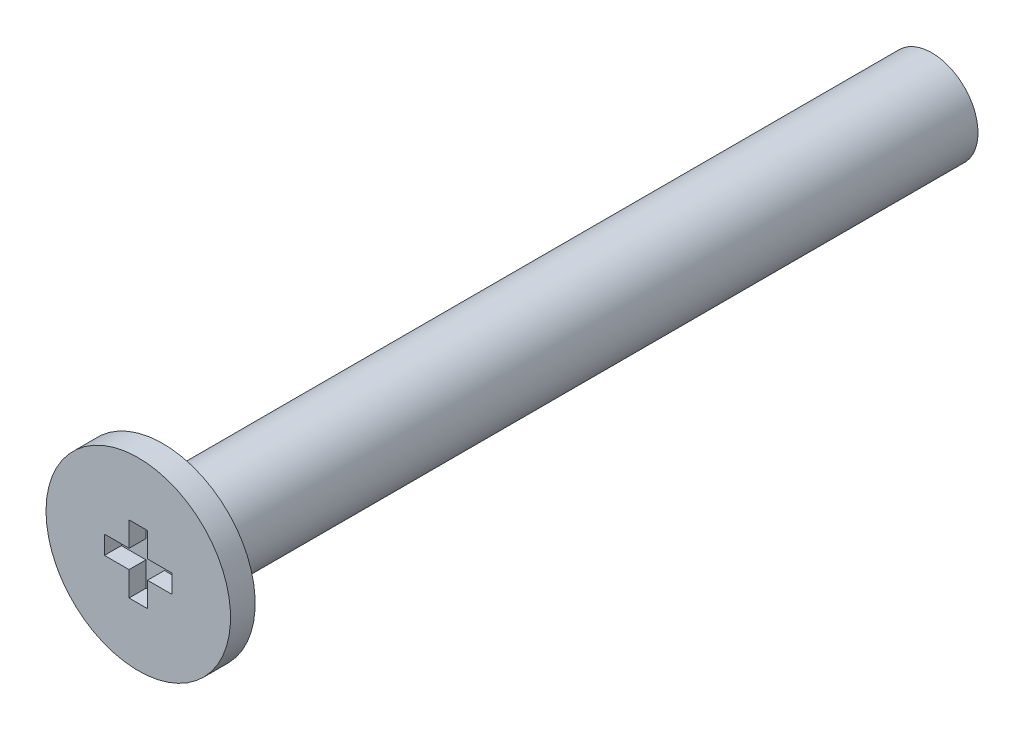
ISO-10303-21;
HEADER;
FILE_DESCRIPTION(('STEP AP214'),'2;1');
FILE_NAME('part.step','',(''),(''),'','','');
FILE_SCHEMA(('AUTOMOTIVE_DESIGN { 1 0 10303 214 1 1 1 1 }'));
ENDSEC;
DATA;
#1=APPLICATION_CONTEXT('core data for automotive mechanical design processes');
#2=APPLICATION_PROTOCOL_DEFINITION('international standard','automotive_design',2000,#1);
#3=PRODUCT_CONTEXT('',#1,'mechanical');
#4=PRODUCT('Part','Part','',(#3));
#5=PRODUCT_RELATED_PRODUCT_CATEGORY('part','',(#4));
#6=PRODUCT_DEFINITION_FORMATION('','',#4);
#7=PRODUCT_DEFINITION_CONTEXT('part definition',#1,'design');
#8=PRODUCT_DEFINITION('design','',#6,#7);
#9=PRODUCT_DEFINITION_SHAPE('','',#8);
#10=(LENGTH_UNIT() NAMED_UNIT(*) SI_UNIT(.MILLI.,.METRE.));
#11=(NAMED_UNIT(*) PLANE_ANGLE_UNIT() SI_UNIT($,.RADIAN.));
#12=(NAMED_UNIT(*) SI_UNIT($,.STERADIAN.) SOLID_ANGLE_UNIT());
#13=UNCERTAINTY_MEASURE_WITH_UNIT(LENGTH_MEASURE(1.E-05),#10,'distance_accuracy_value','');
#14=(GEOMETRIC_REPRESENTATION_CONTEXT(3) GLOBAL_UNCERTAINTY_ASSIGNED_CONTEXT((#13)) GLOBAL_UNIT_ASSIGNED_CONTEXT((#10,
#11,#12)) REPRESENTATION_CONTEXT('',''));
#15=CARTESIAN_POINT('',(0.,0.,0.));
#16=DIRECTION('',(0.,0.,1.));
#17=DIRECTION('',(1.,0.,0.));
#18=AXIS2_PLACEMENT_3D('',#15,#16,#17);
#19=CARTESIAN_POINT('',(0.,0.,-25.));
#20=DIRECTION('',(0.,0.,1.));
#21=DIRECTION('',(1.,0.,0.));
#22=AXIS2_PLACEMENT_3D('',#19,#20,#21);
#23=CYLINDRICAL_SURFACE('',#22,1.5);
#24=CARTESIAN_POINT('',(0.,0.,-25.));
#25=DIRECTION('',(0.,0.,1.));
#26=DIRECTION('',(1.,0.,0.));
#27=AXIS2_PLACEMENT_3D('',#24,#25,#26);
#28=CIRCLE('',#27,1.5);
#29=CARTESIAN_POINT('',(1.5,0.,-25.));
#30=VERTEX_POINT('',#29);
#31=EDGE_CURVE('E212',#30,#30,#28,.T.);
#32=ORIENTED_EDGE('',*,*,#31,.T.);
#33=EDGE_LOOP('',(#32));
#34=FACE_BOUND('',#33,.T.);
#35=CARTESIAN_POINT('',(0.,0.,0.));
#36=DIRECTION('',(0.,0.,1.));
#37=DIRECTION('',(1.,0.,0.));
#38=AXIS2_PLACEMENT_3D('',#35,#36,#37);
#39=CIRCLE('',#38,1.5);
#40=CARTESIAN_POINT('',(1.5,0.,0.));
#41=VERTEX_POINT('',#40);
#42=EDGE_CURVE('E208',#41,#41,#39,.T.);
#43=ORIENTED_EDGE('',*,*,#42,.F.);
#44=EDGE_LOOP('',(#43));
#45=FACE_BOUND('',#44,.T.);
#46=ADVANCED_FACE('F41',(#34,#45),#23,.T.);
#47=CARTESIAN_POINT('',(0.,0.,-25.));
#48=DIRECTION('',(0.,0.,1.));
#49=DIRECTION('',(1.,0.,0.));
#50=AXIS2_PLACEMENT_3D('',#47,#48,#49);
#51=PLANE('',#50);
#52=ORIENTED_EDGE('',*,*,#31,.F.);
#53=EDGE_LOOP('',(#52));
#54=FACE_BOUND('',#53,.T.);
#55=ADVANCED_FACE('F281',(#54),#51,.F.);
#56=CARTESIAN_POINT('',(0.,0.,0.));
#57=DIRECTION('',(0.,0.,1.));
#58=DIRECTION('',(1.,0.,0.));
#59=AXIS2_PLACEMENT_3D('',#56,#57,#58);
#60=PLANE('',#59);
#61=ORIENTED_EDGE('',*,*,#42,.T.);
#62=EDGE_LOOP('',(#61));
#63=FACE_BOUND('',#62,.T.);
#64=CARTESIAN_POINT('',(0.,0.,0.));
#65=DIRECTION('',(0.,0.,-1.));
#66=DIRECTION('',(-1.,0.,0.));
#67=AXIS2_PLACEMENT_3D('',#64,#65,#66);
#68=CIRCLE('',#67,3.);
#69=CARTESIAN_POINT('',(-3.,0.,0.));
#70=VERTEX_POINT('',#69);
#71=EDGE_CURVE('E210',#70,#70,#68,.T.);
#72=ORIENTED_EDGE('',*,*,#71,.T.);
#73=EDGE_LOOP('',(#72));
#74=FACE_BOUND('',#73,.T.);
#75=ADVANCED_FACE('F286',(#63,#74),#60,.F.);
#76=CARTESIAN_POINT('',(0.,0.,-2.));
#77=DIRECTION('',(0.,0.,-1.));
#78=DIRECTION('',(-1.,0.,0.));
#79=AXIS2_PLACEMENT_3D('',#76,#77,#78);
#80=CYLINDRICAL_SURFACE('',#79,3.);
#81=ORIENTED_EDGE('',*,*,#71,.F.);
#82=EDGE_LOOP('',(#81));
#83=FACE_BOUND('',#82,.T.);
#84=CARTESIAN_POINT('',(0.,0.,0.8));
#85=DIRECTION('',(0.,0.,-1.));
#86=DIRECTION('',(-1.,0.,0.));
#87=AXIS2_PLACEMENT_3D('',#84,#85,#86);
#88=CIRCLE('',#87,3.);
#89=CARTESIAN_POINT('',(-3.,0.,0.8));
#90=VERTEX_POINT('',#89);
#91=EDGE_CURVE('E179',#90,#90,#88,.T.);
#92=ORIENTED_EDGE('',*,*,#91,.T.);
#93=EDGE_LOOP('',(#92));
#94=FACE_BOUND('',#93,.T.);
#95=ADVANCED_FACE('F300',(#83,#94),#80,.T.);
#96=CARTESIAN_POINT('',(3.,0.,0.8));
#97=DIRECTION('',(0.,0.,-1.));
#98=DIRECTION('',(-1.,0.,0.));
#99=AXIS2_PLACEMENT_3D('',#96,#97,#98);
#100=PLANE('',#99);
#101=DIRECTION('',(-1.,0.,0.));
#102=VECTOR('',#101,1.);
#103=CARTESIAN_POINT('',(3.,-1.1,0.8));
#104=LINE('',#103,#102);
#105=CARTESIAN_POINT('',(0.3,-1.1,0.8));
#106=VERTEX_POINT('',#105);
#107=CARTESIAN_POINT('',(-0.3,-1.1,0.8));
#108=VERTEX_POINT('',#107);
#109=EDGE_CURVE('E211',#106,#108,#104,.T.);
#110=ORIENTED_EDGE('',*,*,#109,.T.);
#111=DIRECTION('',(0.,1.,0.));
#112=VECTOR('',#111,1.);
#113=CARTESIAN_POINT('',(-0.3,0.,0.8));
#114=LINE('',#113,#112);
#115=CARTESIAN_POINT('',(-0.3,-0.3,0.8));
#116=VERTEX_POINT('',#115);
#117=EDGE_CURVE('E11',#108,#116,#114,.T.);
#118=ORIENTED_EDGE('',*,*,#117,.T.);
#119=DIRECTION('',(-1.,0.,0.));
#120=VECTOR('',#119,1.);
#121=CARTESIAN_POINT('',(3.,-0.3,0.8));
#122=LINE('',#121,#120);
#123=CARTESIAN_POINT('',(-1.1,-0.3,0.8));
#124=VERTEX_POINT('',#123);
#125=EDGE_CURVE('E48',#116,#124,#122,.T.);
#126=ORIENTED_EDGE('',*,*,#125,.T.);
#127=DIRECTION('',(0.,1.,0.));
#128=VECTOR('',#127,1.);
#129=CARTESIAN_POINT('',(-1.1,0.,0.8));
#130=LINE('',#129,#128);
#131=CARTESIAN_POINT('',(-1.1,0.3,0.8));
#132=VERTEX_POINT('',#131);
#133=EDGE_CURVE('E241',#124,#132,#130,.T.);
#134=ORIENTED_EDGE('',*,*,#133,.T.);
#135=DIRECTION('',(1.,0.,0.));
#136=VECTOR('',#135,1.);
#137=CARTESIAN_POINT('',(3.,0.3,0.8));
#138=LINE('',#137,#136);
#139=CARTESIAN_POINT('',(-0.3,0.3,0.8));
#140=VERTEX_POINT('',#139);
#141=EDGE_CURVE('E236',#132,#140,#138,.T.);
#142=ORIENTED_EDGE('',*,*,#141,.T.);
#143=DIRECTION('',(0.,1.,0.));
#144=VECTOR('',#143,1.);
#145=CARTESIAN_POINT('',(-0.3,0.,0.8));
#146=LINE('',#145,#144);
#147=CARTESIAN_POINT('',(-0.3,1.1,0.8));
#148=VERTEX_POINT('',#147);
#149=EDGE_CURVE('E237',#140,#148,#146,.T.);
#150=ORIENTED_EDGE('',*,*,#149,.T.);
#151=DIRECTION('',(1.,0.,0.));
#152=VECTOR('',#151,1.);
#153=CARTESIAN_POINT('',(3.,1.1,0.8));
#154=LINE('',#153,#152);
#155=CARTESIAN_POINT('',(0.3,1.1,0.8));
#156=VERTEX_POINT('',#155);
#157=EDGE_CURVE('E231',#148,#156,#154,.T.);
#158=ORIENTED_EDGE('',*,*,#157,.T.);
#159=DIRECTION('',(0.,-1.,0.));
#160=VECTOR('',#159,1.);
#161=CARTESIAN_POINT('',(0.3,0.,0.8));
#162=LINE('',#161,#160);
#163=CARTESIAN_POINT('',(0.3,0.3,0.8));
#164=VERTEX_POINT('',#163);
#165=EDGE_CURVE('E228',#156,#164,#162,.T.);
#166=ORIENTED_EDGE('',*,*,#165,.T.);
#167=DIRECTION('',(1.,0.,0.));
#168=VECTOR('',#167,1.);
#169=CARTESIAN_POINT('',(3.,0.3,0.8));
#170=LINE('',#169,#168);
#171=CARTESIAN_POINT('',(1.1,0.3,0.8));
#172=VERTEX_POINT('',#171);
#173=EDGE_CURVE('E229',#164,#172,#170,.T.);
#174=ORIENTED_EDGE('',*,*,#173,.T.);
#175=DIRECTION('',(0.,-1.,0.));
#176=VECTOR('',#175,1.);
#177=CARTESIAN_POINT('',(1.1,0.,0.8));
#178=LINE('',#177,#176);
#179=CARTESIAN_POINT('',(1.1,-0.3,0.8));
#180=VERTEX_POINT('',#179);
#181=EDGE_CURVE('E224',#172,#180,#178,.T.);
#182=ORIENTED_EDGE('',*,*,#181,.T.);
#183=DIRECTION('',(-1.,0.,0.));
#184=VECTOR('',#183,1.);
#185=CARTESIAN_POINT('',(3.,-0.3,0.8));
#186=LINE('',#185,#184);
#187=CARTESIAN_POINT('',(0.3,-0.3,0.8));
#188=VERTEX_POINT('',#187);
#189=EDGE_CURVE('E222',#180,#188,#186,.T.);
#190=ORIENTED_EDGE('',*,*,#189,.T.);
#191=DIRECTION('',(0.,-1.,0.));
#192=VECTOR('',#191,1.);
#193=CARTESIAN_POINT('',(0.3,0.,0.8));
#194=LINE('',#193,#192);
#195=EDGE_CURVE('E220',#188,#106,#194,.T.);
#196=ORIENTED_EDGE('',*,*,#195,.T.);
#197=EDGE_LOOP('',(#110,#118,#126,#134,#142,#150,#158,#166,#174,#182,#190,#196));
#198=FACE_BOUND('',#197,.T.);
#199=ORIENTED_EDGE('',*,*,#91,.F.);
#200=EDGE_LOOP('',(#199));
#201=FACE_BOUND('',#200,.T.);
#202=ADVANCED_FACE('F242',(#198,#201),#100,.F.);
#203=CARTESIAN_POINT('',(-0.3,-0.3,0.25));
#204=DIRECTION('',(-1.,0.,0.));
#205=DIRECTION('',(0.,0.,1.));
#206=AXIS2_PLACEMENT_3D('',#203,#204,#205);
#207=PLANE('',#206);
#208=DIRECTION('',(0.,0.,1.));
#209=VECTOR('',#208,1.);
#210=CARTESIAN_POINT('',(-0.3,-1.1,0.25));
#211=LINE('',#210,#209);
#212=CARTESIAN_POINT('',(-0.3,-1.1,0.25));
#213=VERTEX_POINT('',#212);
#214=EDGE_CURVE('E54',#213,#108,#211,.T.);
#215=ORIENTED_EDGE('',*,*,#214,.F.);
#216=DIRECTION('',(0.,-1.,0.));
#217=VECTOR('',#216,1.);
#218=CARTESIAN_POINT('',(-0.3,-0.3,0.25));
#219=LINE('',#218,#217);
#220=CARTESIAN_POINT('',(-0.3,-0.3,0.25));
#221=VERTEX_POINT('',#220);
#222=EDGE_CURVE('E129',#221,#213,#219,.T.);
#223=ORIENTED_EDGE('',*,*,#222,.F.);
#224=DIRECTION('',(0.,0.,1.));
#225=VECTOR('',#224,1.);
#226=CARTESIAN_POINT('',(-0.3,-0.3,0.25));
#227=LINE('',#226,#225);
#228=EDGE_CURVE('E171',#221,#116,#227,.T.);
#229=ORIENTED_EDGE('',*,*,#228,.T.);
#230=ORIENTED_EDGE('',*,*,#117,.F.);
#231=EDGE_LOOP('',(#215,#223,#229,#230));
#232=FACE_BOUND('',#231,.T.);
#233=ADVANCED_FACE('F127',(#232),#207,.F.);
#234=CARTESIAN_POINT('',(-1.1,-0.3,0.25));
#235=DIRECTION('',(0.,-1.,0.));
#236=DIRECTION('',(0.,0.,-1.));
#237=AXIS2_PLACEMENT_3D('',#234,#235,#236);
#238=PLANE('',#237);
#239=ORIENTED_EDGE('',*,*,#228,.F.);
#240=DIRECTION('',(1.,0.,0.));
#241=VECTOR('',#240,1.);
#242=CARTESIAN_POINT('',(-1.1,-0.3,0.25));
#243=LINE('',#242,#241);
#244=CARTESIAN_POINT('',(-1.1,-0.3,0.25));
#245=VERTEX_POINT('',#244);
#246=EDGE_CURVE('E131',#245,#221,#243,.T.);
#247=ORIENTED_EDGE('',*,*,#246,.F.);
#248=DIRECTION('',(0.,0.,1.));
#249=VECTOR('',#248,1.);
#250=CARTESIAN_POINT('',(-1.1,-0.3,0.25));
#251=LINE('',#250,#249);
#252=EDGE_CURVE('E180',#245,#124,#251,.T.);
#253=ORIENTED_EDGE('',*,*,#252,.T.);
#254=ORIENTED_EDGE('',*,*,#125,.F.);
#255=EDGE_LOOP('',(#239,#247,#253,#254));
#256=FACE_BOUND('',#255,.T.);
#257=ADVANCED_FACE('F273',(#256),#238,.F.);
#258=CARTESIAN_POINT('',(-1.1,0.3,0.25));
#259=DIRECTION('',(-1.,0.,0.));
#260=DIRECTION('',(0.,0.,1.));
#261=AXIS2_PLACEMENT_3D('',#258,#259,#260);
#262=PLANE('',#261);
#263=ORIENTED_EDGE('',*,*,#252,.F.);
#264=DIRECTION('',(0.,-1.,0.));
#265=VECTOR('',#264,1.);
#266=CARTESIAN_POINT('',(-1.1,0.3,0.25));
#267=LINE('',#266,#265);
#268=CARTESIAN_POINT('',(-1.1,0.3,0.25));
#269=VERTEX_POINT('',#268);
#270=EDGE_CURVE('E175',#269,#245,#267,.T.);
#271=ORIENTED_EDGE('',*,*,#270,.F.);
#272=DIRECTION('',(0.,0.,1.));
#273=VECTOR('',#272,1.);
#274=CARTESIAN_POINT('',(-1.1,0.3,0.25));
#275=LINE('',#274,#273);
#276=EDGE_CURVE('E178',#269,#132,#275,.T.);
#277=ORIENTED_EDGE('',*,*,#276,.T.);
#278=ORIENTED_EDGE('',*,*,#133,.F.);
#279=EDGE_LOOP('',(#263,#271,#277,#278));
#280=FACE_BOUND('',#279,.T.);
#281=ADVANCED_FACE('F275',(#280),#262,.F.);
#282=CARTESIAN_POINT('',(-0.3,0.3,0.25));
#283=DIRECTION('',(0.,1.,0.));
#284=DIRECTION('',(0.,0.,1.));
#285=AXIS2_PLACEMENT_3D('',#282,#283,#284);
#286=PLANE('',#285);
#287=ORIENTED_EDGE('',*,*,#276,.F.);
#288=DIRECTION('',(-1.,0.,0.));
#289=VECTOR('',#288,1.);
#290=CARTESIAN_POINT('',(-0.3,0.3,0.25));
#291=LINE('',#290,#289);
#292=CARTESIAN_POINT('',(-0.3,0.3,0.25));
#293=VERTEX_POINT('',#292);
#294=EDGE_CURVE('E168',#293,#269,#291,.T.);
#295=ORIENTED_EDGE('',*,*,#294,.F.);
#296=DIRECTION('',(0.,0.,1.));
#297=VECTOR('',#296,1.);
#298=CARTESIAN_POINT('',(-0.3,0.3,0.25));
#299=LINE('',#298,#297);
#300=EDGE_CURVE('E181',#293,#140,#299,.T.);
#301=ORIENTED_EDGE('',*,*,#300,.T.);
#302=ORIENTED_EDGE('',*,*,#141,.F.);
#303=EDGE_LOOP('',(#287,#295,#301,#302));
#304=FACE_BOUND('',#303,.T.);
#305=ADVANCED_FACE('F269',(#304),#286,.F.);
#306=CARTESIAN_POINT('',(-0.3,1.1,0.25));
#307=DIRECTION('',(-1.,0.,0.));
#308=DIRECTION('',(0.,0.,1.));
#309=AXIS2_PLACEMENT_3D('',#306,#307,#308);
#310=PLANE('',#309);
#311=ORIENTED_EDGE('',*,*,#300,.F.);
#312=DIRECTION('',(0.,-1.,0.));
#313=VECTOR('',#312,1.);
#314=CARTESIAN_POINT('',(-0.3,1.1,0.25));
#315=LINE('',#314,#313);
#316=CARTESIAN_POINT('',(-0.3,1.1,0.25));
#317=VERTEX_POINT('',#316);
#318=EDGE_CURVE('E169',#317,#293,#315,.T.);
#319=ORIENTED_EDGE('',*,*,#318,.F.);
#320=DIRECTION('',(0.,0.,1.));
#321=VECTOR('',#320,1.);
#322=CARTESIAN_POINT('',(-0.3,1.1,0.25));
#323=LINE('',#322,#321);
#324=EDGE_CURVE('E188',#317,#148,#323,.T.);
#325=ORIENTED_EDGE('',*,*,#324,.T.);
#326=ORIENTED_EDGE('',*,*,#149,.F.);
#327=EDGE_LOOP('',(#311,#319,#325,#326));
#328=FACE_BOUND('',#327,.T.);
#329=ADVANCED_FACE('F266',(#328),#310,.F.);
#330=CARTESIAN_POINT('',(0.3,1.1,0.25));
#331=DIRECTION('',(0.,1.,0.));
#332=DIRECTION('',(0.,0.,1.));
#333=AXIS2_PLACEMENT_3D('',#330,#331,#332);
#334=PLANE('',#333);
#335=ORIENTED_EDGE('',*,*,#324,.F.);
#336=DIRECTION('',(-1.,0.,0.));
#337=VECTOR('',#336,1.);
#338=CARTESIAN_POINT('',(0.3,1.1,0.25));
#339=LINE('',#338,#337);
#340=CARTESIAN_POINT('',(0.3,1.1,0.25));
#341=VERTEX_POINT('',#340);
#342=EDGE_CURVE('E164',#341,#317,#339,.T.);
#343=ORIENTED_EDGE('',*,*,#342,.F.);
#344=DIRECTION('',(0.,0.,1.));
#345=VECTOR('',#344,1.);
#346=CARTESIAN_POINT('',(0.3,1.1,0.25));
#347=LINE('',#346,#345);
#348=EDGE_CURVE('E189',#341,#156,#347,.T.);
#349=ORIENTED_EDGE('',*,*,#348,.T.);
#350=ORIENTED_EDGE('',*,*,#157,.F.);
#351=EDGE_LOOP('',(#335,#343,#349,#350));
#352=FACE_BOUND('',#351,.T.);
#353=ADVANCED_FACE('F261',(#352),#334,.F.);
#354=CARTESIAN_POINT('',(0.3,0.3,0.25));
#355=DIRECTION('',(1.,0.,0.));
#356=DIRECTION('',(0.,0.,-1.));
#357=AXIS2_PLACEMENT_3D('',#354,#355,#356);
#358=PLANE('',#357);
#359=ORIENTED_EDGE('',*,*,#348,.F.);
#360=DIRECTION('',(0.,1.,0.));
#361=VECTOR('',#360,1.);
#362=CARTESIAN_POINT('',(0.3,0.3,0.25));
#363=LINE('',#362,#361);
#364=CARTESIAN_POINT('',(0.3,0.3,0.25));
#365=VERTEX_POINT('',#364);
#366=EDGE_CURVE('E158',#365,#341,#363,.T.);
#367=ORIENTED_EDGE('',*,*,#366,.F.);
#368=DIRECTION('',(0.,0.,1.));
#369=VECTOR('',#368,1.);
#370=CARTESIAN_POINT('',(0.3,0.3,0.25));
#371=LINE('',#370,#369);
#372=EDGE_CURVE('E195',#365,#164,#371,.T.);
#373=ORIENTED_EDGE('',*,*,#372,.T.);
#374=ORIENTED_EDGE('',*,*,#165,.F.);
#375=EDGE_LOOP('',(#359,#367,#373,#374));
#376=FACE_BOUND('',#375,.T.);
#377=ADVANCED_FACE('F263',(#376),#358,.F.);
#378=CARTESIAN_POINT('',(1.1,0.3,0.25));
#379=DIRECTION('',(0.,1.,0.));
#380=DIRECTION('',(0.,0.,1.));
#381=AXIS2_PLACEMENT_3D('',#378,#379,#380);
#382=PLANE('',#381);
#383=ORIENTED_EDGE('',*,*,#372,.F.);
#384=DIRECTION('',(-1.,0.,0.));
#385=VECTOR('',#384,1.);
#386=CARTESIAN_POINT('',(1.1,0.3,0.25));
#387=LINE('',#386,#385);
#388=CARTESIAN_POINT('',(1.1,0.3,0.25));
#389=VERTEX_POINT('',#388);
#390=EDGE_CURVE('E160',#389,#365,#387,.T.);
#391=ORIENTED_EDGE('',*,*,#390,.F.);
#392=DIRECTION('',(0.,0.,1.));
#393=VECTOR('',#392,1.);
#394=CARTESIAN_POINT('',(1.1,0.3,0.25));
#395=LINE('',#394,#393);
#396=EDGE_CURVE('E194',#389,#172,#395,.T.);
#397=ORIENTED_EDGE('',*,*,#396,.T.);
#398=ORIENTED_EDGE('',*,*,#173,.F.);
#399=EDGE_LOOP('',(#383,#391,#397,#398));
#400=FACE_BOUND('',#399,.T.);
#401=ADVANCED_FACE('F257',(#400),#382,.F.);
#402=CARTESIAN_POINT('',(1.1,-0.3,0.25));
#403=DIRECTION('',(1.,0.,0.));
#404=DIRECTION('',(0.,0.,-1.));
#405=AXIS2_PLACEMENT_3D('',#402,#403,#404);
#406=PLANE('',#405);
#407=ORIENTED_EDGE('',*,*,#396,.F.);
#408=DIRECTION('',(0.,1.,0.));
#409=VECTOR('',#408,1.);
#410=CARTESIAN_POINT('',(1.1,-0.3,0.25));
#411=LINE('',#410,#409);
#412=CARTESIAN_POINT('',(1.1,-0.3,0.25));
#413=VERTEX_POINT('',#412);
#414=EDGE_CURVE('E151',#413,#389,#411,.T.);
#415=ORIENTED_EDGE('',*,*,#414,.F.);
#416=DIRECTION('',(0.,0.,1.));
#417=VECTOR('',#416,1.);
#418=CARTESIAN_POINT('',(1.1,-0.3,0.25));
#419=LINE('',#418,#417);
#420=EDGE_CURVE('E198',#413,#180,#419,.T.);
#421=ORIENTED_EDGE('',*,*,#420,.T.);
#422=ORIENTED_EDGE('',*,*,#181,.F.);
#423=EDGE_LOOP('',(#407,#415,#421,#422));
#424=FACE_BOUND('',#423,.T.);
#425=ADVANCED_FACE('F251',(#424),#406,.F.);
#426=CARTESIAN_POINT('',(0.3,-0.3,0.25));
#427=DIRECTION('',(0.,-1.,0.));
#428=DIRECTION('',(0.,0.,-1.));
#429=AXIS2_PLACEMENT_3D('',#426,#427,#428);
#430=PLANE('',#429);
#431=ORIENTED_EDGE('',*,*,#420,.F.);
#432=DIRECTION('',(1.,0.,0.));
#433=VECTOR('',#432,1.);
#434=CARTESIAN_POINT('',(0.3,-0.3,0.25));
#435=LINE('',#434,#433);
#436=CARTESIAN_POINT('',(0.3,-0.3,0.25));
#437=VERTEX_POINT('',#436);
#438=EDGE_CURVE('E152',#437,#413,#435,.T.);
#439=ORIENTED_EDGE('',*,*,#438,.F.);
#440=DIRECTION('',(0.,0.,1.));
#441=VECTOR('',#440,1.);
#442=CARTESIAN_POINT('',(0.3,-0.3,0.25));
#443=LINE('',#442,#441);
#444=EDGE_CURVE('E201',#437,#188,#443,.T.);
#445=ORIENTED_EDGE('',*,*,#444,.T.);
#446=ORIENTED_EDGE('',*,*,#189,.F.);
#447=EDGE_LOOP('',(#431,#439,#445,#446));
#448=FACE_BOUND('',#447,.T.);
#449=ADVANCED_FACE('F254',(#448),#430,.F.);
#450=CARTESIAN_POINT('',(0.3,-1.1,0.25));
#451=DIRECTION('',(1.,0.,0.));
#452=DIRECTION('',(0.,0.,-1.));
#453=AXIS2_PLACEMENT_3D('',#450,#451,#452);
#454=PLANE('',#453);
#455=ORIENTED_EDGE('',*,*,#444,.F.);
#456=DIRECTION('',(0.,1.,0.));
#457=VECTOR('',#456,1.);
#458=CARTESIAN_POINT('',(0.3,-1.1,0.25));
#459=LINE('',#458,#457);
#460=CARTESIAN_POINT('',(0.3,-1.1,0.25));
#461=VERTEX_POINT('',#460);
#462=EDGE_CURVE('E145',#461,#437,#459,.T.);
#463=ORIENTED_EDGE('',*,*,#462,.F.);
#464=DIRECTION('',(0.,0.,1.));
#465=VECTOR('',#464,1.);
#466=CARTESIAN_POINT('',(0.3,-1.1,0.25));
#467=LINE('',#466,#465);
#468=EDGE_CURVE('E134',#461,#106,#467,.T.);
#469=ORIENTED_EDGE('',*,*,#468,.T.);
#470=ORIENTED_EDGE('',*,*,#195,.F.);
#471=EDGE_LOOP('',(#455,#463,#469,#470));
#472=FACE_BOUND('',#471,.T.);
#473=ADVANCED_FACE('F248',(#472),#454,.F.);
#474=CARTESIAN_POINT('',(-0.3,-1.1,0.25));
#475=DIRECTION('',(0.,-1.,0.));
#476=DIRECTION('',(0.,0.,-1.));
#477=AXIS2_PLACEMENT_3D('',#474,#475,#476);
#478=PLANE('',#477);
#479=ORIENTED_EDGE('',*,*,#468,.F.);
#480=DIRECTION('',(1.,0.,0.));
#481=VECTOR('',#480,1.);
#482=CARTESIAN_POINT('',(-0.3,-1.1,0.25));
#483=LINE('',#482,#481);
#484=EDGE_CURVE('E140',#213,#461,#483,.T.);
#485=ORIENTED_EDGE('',*,*,#484,.F.);
#486=ORIENTED_EDGE('',*,*,#214,.T.);
#487=ORIENTED_EDGE('',*,*,#109,.F.);
#488=EDGE_LOOP('',(#479,#485,#486,#487));
#489=FACE_BOUND('',#488,.T.);
#490=ADVANCED_FACE('F139',(#489),#478,.F.);
#491=CARTESIAN_POINT('',(0.,0.,0.25));
#492=DIRECTION('',(0.,0.,1.));
#493=DIRECTION('',(1.,0.,0.));
#494=AXIS2_PLACEMENT_3D('',#491,#492,#493);
#495=PLANE('',#494);
#496=ORIENTED_EDGE('',*,*,#222,.T.);
#497=ORIENTED_EDGE('',*,*,#484,.T.);
#498=ORIENTED_EDGE('',*,*,#462,.T.);
#499=ORIENTED_EDGE('',*,*,#438,.T.);
#500=ORIENTED_EDGE('',*,*,#414,.T.);
#501=ORIENTED_EDGE('',*,*,#390,.T.);
#502=ORIENTED_EDGE('',*,*,#366,.T.);
#503=ORIENTED_EDGE('',*,*,#342,.T.);
#504=ORIENTED_EDGE('',*,*,#318,.T.);
#505=ORIENTED_EDGE('',*,*,#294,.T.);
#506=ORIENTED_EDGE('',*,*,#270,.T.);
#507=ORIENTED_EDGE('',*,*,#246,.T.);
#508=EDGE_LOOP('',(#496,#497,#498,#499,#500,#501,#502,#503,#504,#505,#506,#507));
#509=FACE_BOUND('',#508,.T.);
#510=ADVANCED_FACE('F142',(#509),#495,.T.);
#511=CLOSED_SHELL('',(#46,#55,#75,#95,#202,#233,#257,#281,#305,#329,#353,#377,#401,#425,#449,
#473,#490,#510));
#512=MANIFOLD_SOLID_BREP('B2',#511);
#513=ADVANCED_BREP_SHAPE_REPRESENTATION('',(#18,#512),#14);
#514=SHAPE_DEFINITION_REPRESENTATION(#9,#513);
ENDSEC;
END-ISO-10303-21;
